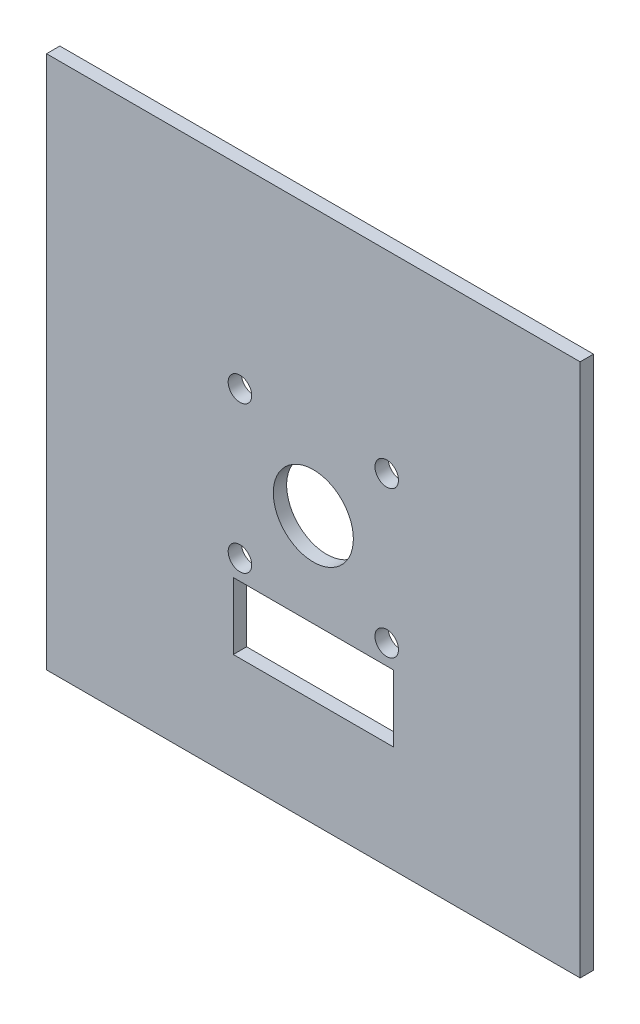
ISO-10303-21;
HEADER;
FILE_DESCRIPTION(('STEP AP214'),'2;1');
FILE_NAME('part.step','',(''),(''),'','','');
FILE_SCHEMA(('AUTOMOTIVE_DESIGN { 1 0 10303 214 1 1 1 1 }'));
ENDSEC;
DATA;
#1=APPLICATION_CONTEXT('core data for automotive mechanical design processes');
#2=APPLICATION_PROTOCOL_DEFINITION('international standard','automotive_design',2000,#1);
#3=PRODUCT_CONTEXT('',#1,'mechanical');
#4=PRODUCT('Part','Part','',(#3));
#5=PRODUCT_RELATED_PRODUCT_CATEGORY('part','',(#4));
#6=PRODUCT_DEFINITION_FORMATION('','',#4);
#7=PRODUCT_DEFINITION_CONTEXT('part definition',#1,'design');
#8=PRODUCT_DEFINITION('design','',#6,#7);
#9=PRODUCT_DEFINITION_SHAPE('','',#8);
#10=(LENGTH_UNIT() NAMED_UNIT(*) SI_UNIT(.MILLI.,.METRE.));
#11=(NAMED_UNIT(*) PLANE_ANGLE_UNIT() SI_UNIT($,.RADIAN.));
#12=(NAMED_UNIT(*) SI_UNIT($,.STERADIAN.) SOLID_ANGLE_UNIT());
#13=UNCERTAINTY_MEASURE_WITH_UNIT(LENGTH_MEASURE(1.E-05),#10,'distance_accuracy_value','');
#14=(GEOMETRIC_REPRESENTATION_CONTEXT(3) GLOBAL_UNCERTAINTY_ASSIGNED_CONTEXT((#13)) GLOBAL_UNIT_ASSIGNED_CONTEXT((#10,
#11,#12)) REPRESENTATION_CONTEXT('',''));
#15=CARTESIAN_POINT('',(0.,0.,0.));
#16=DIRECTION('',(0.,0.,1.));
#17=DIRECTION('',(1.,0.,0.));
#18=AXIS2_PLACEMENT_3D('',#15,#16,#17);
#19=CARTESIAN_POINT('',(0.,-127.,3.175));
#20=DIRECTION('',(0.,1.,0.));
#21=DIRECTION('',(0.,0.,1.));
#22=AXIS2_PLACEMENT_3D('',#19,#20,#21);
#23=PLANE('',#22);
#24=DIRECTION('',(1.,0.,0.));
#25=VECTOR('',#24,1.);
#26=CARTESIAN_POINT('',(0.,-127.,-3.175));
#27=LINE('',#26,#25);
#28=CARTESIAN_POINT('',(-127.,-127.,-3.175));
#29=VERTEX_POINT('',#28);
#30=CARTESIAN_POINT('',(127.,-127.,-3.175));
#31=VERTEX_POINT('',#30);
#32=EDGE_CURVE('E158',#29,#31,#27,.T.);
#33=ORIENTED_EDGE('',*,*,#32,.T.);
#34=DIRECTION('',(0.,0.,-1.));
#35=VECTOR('',#34,1.);
#36=CARTESIAN_POINT('',(127.,-127.,3.175));
#37=LINE('',#36,#35);
#38=CARTESIAN_POINT('',(127.,-127.,3.175));
#39=VERTEX_POINT('',#38);
#40=EDGE_CURVE('E11',#39,#31,#37,.T.);
#41=ORIENTED_EDGE('',*,*,#40,.F.);
#42=DIRECTION('',(1.,0.,0.));
#43=VECTOR('',#42,1.);
#44=CARTESIAN_POINT('',(0.,-127.,3.175));
#45=LINE('',#44,#43);
#46=CARTESIAN_POINT('',(-127.,-127.,3.175));
#47=VERTEX_POINT('',#46);
#48=EDGE_CURVE('E114',#47,#39,#45,.T.);
#49=ORIENTED_EDGE('',*,*,#48,.F.);
#50=DIRECTION('',(0.,0.,-1.));
#51=VECTOR('',#50,1.);
#52=CARTESIAN_POINT('',(-127.,-127.,3.175));
#53=LINE('',#52,#51);
#54=EDGE_CURVE('E53',#47,#29,#53,.T.);
#55=ORIENTED_EDGE('',*,*,#54,.T.);
#56=EDGE_LOOP('',(#33,#41,#49,#55));
#57=FACE_BOUND('',#56,.T.);
#58=ADVANCED_FACE('F34',(#57),#23,.F.);
#59=CARTESIAN_POINT('',(127.,0.,3.175));
#60=DIRECTION('',(-1.,0.,0.));
#61=DIRECTION('',(0.,0.,1.));
#62=AXIS2_PLACEMENT_3D('',#59,#60,#61);
#63=PLANE('',#62);
#64=DIRECTION('',(0.,1.,0.));
#65=VECTOR('',#64,1.);
#66=CARTESIAN_POINT('',(127.,0.,-3.175));
#67=LINE('',#66,#65);
#68=CARTESIAN_POINT('',(127.,127.,-3.175));
#69=VERTEX_POINT('',#68);
#70=EDGE_CURVE('E120',#31,#69,#67,.T.);
#71=ORIENTED_EDGE('',*,*,#70,.T.);
#72=DIRECTION('',(0.,0.,-1.));
#73=VECTOR('',#72,1.);
#74=CARTESIAN_POINT('',(127.,127.,3.175));
#75=LINE('',#74,#73);
#76=CARTESIAN_POINT('',(127.,127.,3.175));
#77=VERTEX_POINT('',#76);
#78=EDGE_CURVE('E44',#77,#69,#75,.T.);
#79=ORIENTED_EDGE('',*,*,#78,.F.);
#80=DIRECTION('',(0.,1.,0.));
#81=VECTOR('',#80,1.);
#82=CARTESIAN_POINT('',(127.,0.,3.175));
#83=LINE('',#82,#81);
#84=EDGE_CURVE('E107',#39,#77,#83,.T.);
#85=ORIENTED_EDGE('',*,*,#84,.F.);
#86=ORIENTED_EDGE('',*,*,#40,.T.);
#87=EDGE_LOOP('',(#71,#79,#85,#86));
#88=FACE_BOUND('',#87,.T.);
#89=ADVANCED_FACE('F119',(#88),#63,.F.);
#90=CARTESIAN_POINT('',(0.,127.,3.175));
#91=DIRECTION('',(0.,1.,0.));
#92=DIRECTION('',(0.,0.,1.));
#93=AXIS2_PLACEMENT_3D('',#90,#91,#92);
#94=PLANE('',#93);
#95=DIRECTION('',(1.,0.,0.));
#96=VECTOR('',#95,1.);
#97=CARTESIAN_POINT('',(0.,127.,-3.175));
#98=LINE('',#97,#96);
#99=CARTESIAN_POINT('',(-127.,127.,-3.175));
#100=VERTEX_POINT('',#99);
#101=EDGE_CURVE('E161',#100,#69,#98,.T.);
#102=ORIENTED_EDGE('',*,*,#101,.F.);
#103=DIRECTION('',(0.,0.,-1.));
#104=VECTOR('',#103,1.);
#105=CARTESIAN_POINT('',(-127.,127.,3.175));
#106=LINE('',#105,#104);
#107=CARTESIAN_POINT('',(-127.,127.,3.175));
#108=VERTEX_POINT('',#107);
#109=EDGE_CURVE('E79',#108,#100,#106,.T.);
#110=ORIENTED_EDGE('',*,*,#109,.F.);
#111=DIRECTION('',(1.,0.,0.));
#112=VECTOR('',#111,1.);
#113=CARTESIAN_POINT('',(0.,127.,3.175));
#114=LINE('',#113,#112);
#115=EDGE_CURVE('E113',#108,#77,#114,.T.);
#116=ORIENTED_EDGE('',*,*,#115,.T.);
#117=ORIENTED_EDGE('',*,*,#78,.T.);
#118=EDGE_LOOP('',(#102,#110,#116,#117));
#119=FACE_BOUND('',#118,.T.);
#120=ADVANCED_FACE('F124',(#119),#94,.T.);
#121=CARTESIAN_POINT('',(38.1,0.,3.175));
#122=DIRECTION('',(-1.,0.,0.));
#123=DIRECTION('',(0.,0.,1.));
#124=AXIS2_PLACEMENT_3D('',#121,#122,#123);
#125=PLANE('',#124);
#126=DIRECTION('',(0.,1.,0.));
#127=VECTOR('',#126,1.);
#128=CARTESIAN_POINT('',(38.1,0.,-3.175));
#129=LINE('',#128,#127);
#130=CARTESIAN_POINT('',(38.1,-76.2,-3.175));
#131=VERTEX_POINT('',#130);
#132=CARTESIAN_POINT('',(38.1,-44.45,-3.175));
#133=VERTEX_POINT('',#132);
#134=EDGE_CURVE('E146',#131,#133,#129,.T.);
#135=ORIENTED_EDGE('',*,*,#134,.F.);
#136=DIRECTION('',(0.,0.,-1.));
#137=VECTOR('',#136,1.);
#138=CARTESIAN_POINT('',(38.1,-76.2,3.175));
#139=LINE('',#138,#137);
#140=CARTESIAN_POINT('',(38.1,-76.2,3.175));
#141=VERTEX_POINT('',#140);
#142=EDGE_CURVE('E38',#141,#131,#139,.T.);
#143=ORIENTED_EDGE('',*,*,#142,.F.);
#144=DIRECTION('',(0.,1.,0.));
#145=VECTOR('',#144,1.);
#146=CARTESIAN_POINT('',(38.1,0.,3.175));
#147=LINE('',#146,#145);
#148=CARTESIAN_POINT('',(38.1,-44.45,3.175));
#149=VERTEX_POINT('',#148);
#150=EDGE_CURVE('E203',#141,#149,#147,.T.);
#151=ORIENTED_EDGE('',*,*,#150,.T.);
#152=DIRECTION('',(0.,0.,-1.));
#153=VECTOR('',#152,1.);
#154=CARTESIAN_POINT('',(38.1,-44.45,3.175));
#155=LINE('',#154,#153);
#156=EDGE_CURVE('E136',#149,#133,#155,.T.);
#157=ORIENTED_EDGE('',*,*,#156,.T.);
#158=EDGE_LOOP('',(#135,#143,#151,#157));
#159=FACE_BOUND('',#158,.T.);
#160=ADVANCED_FACE('F188',(#159),#125,.T.);
#161=CARTESIAN_POINT('',(0.,-76.2,3.175));
#162=DIRECTION('',(0.,1.,0.));
#163=DIRECTION('',(0.,0.,1.));
#164=AXIS2_PLACEMENT_3D('',#161,#162,#163);
#165=PLANE('',#164);
#166=DIRECTION('',(1.,0.,0.));
#167=VECTOR('',#166,1.);
#168=CARTESIAN_POINT('',(0.,-76.2,-3.175));
#169=LINE('',#168,#167);
#170=CARTESIAN_POINT('',(-38.1,-76.2,-3.175));
#171=VERTEX_POINT('',#170);
#172=EDGE_CURVE('E149',#171,#131,#169,.T.);
#173=ORIENTED_EDGE('',*,*,#172,.F.);
#174=DIRECTION('',(0.,0.,-1.));
#175=VECTOR('',#174,1.);
#176=CARTESIAN_POINT('',(-38.1,-76.2,3.175));
#177=LINE('',#176,#175);
#178=CARTESIAN_POINT('',(-38.1,-76.2,3.175));
#179=VERTEX_POINT('',#178);
#180=EDGE_CURVE('E178',#179,#171,#177,.T.);
#181=ORIENTED_EDGE('',*,*,#180,.F.);
#182=DIRECTION('',(1.,0.,0.));
#183=VECTOR('',#182,1.);
#184=CARTESIAN_POINT('',(0.,-76.2,3.175));
#185=LINE('',#184,#183);
#186=EDGE_CURVE('E187',#179,#141,#185,.T.);
#187=ORIENTED_EDGE('',*,*,#186,.T.);
#188=ORIENTED_EDGE('',*,*,#142,.T.);
#189=EDGE_LOOP('',(#173,#181,#187,#188));
#190=FACE_BOUND('',#189,.T.);
#191=ADVANCED_FACE('F185',(#190),#165,.T.);
#192=CARTESIAN_POINT('',(-38.1,0.,3.175));
#193=DIRECTION('',(-1.,0.,0.));
#194=DIRECTION('',(0.,0.,1.));
#195=AXIS2_PLACEMENT_3D('',#192,#193,#194);
#196=PLANE('',#195);
#197=DIRECTION('',(0.,1.,0.));
#198=VECTOR('',#197,1.);
#199=CARTESIAN_POINT('',(-38.1,0.,-3.175));
#200=LINE('',#199,#198);
#201=CARTESIAN_POINT('',(-38.1,-44.45,-3.175));
#202=VERTEX_POINT('',#201);
#203=EDGE_CURVE('E152',#171,#202,#200,.T.);
#204=ORIENTED_EDGE('',*,*,#203,.T.);
#205=DIRECTION('',(0.,0.,-1.));
#206=VECTOR('',#205,1.);
#207=CARTESIAN_POINT('',(-38.1,-44.45,3.175));
#208=LINE('',#207,#206);
#209=CARTESIAN_POINT('',(-38.1,-44.45,3.175));
#210=VERTEX_POINT('',#209);
#211=EDGE_CURVE('E176',#210,#202,#208,.T.);
#212=ORIENTED_EDGE('',*,*,#211,.F.);
#213=DIRECTION('',(0.,1.,0.));
#214=VECTOR('',#213,1.);
#215=CARTESIAN_POINT('',(-38.1,0.,3.175));
#216=LINE('',#215,#214);
#217=EDGE_CURVE('E196',#179,#210,#216,.T.);
#218=ORIENTED_EDGE('',*,*,#217,.F.);
#219=ORIENTED_EDGE('',*,*,#180,.T.);
#220=EDGE_LOOP('',(#204,#212,#218,#219));
#221=FACE_BOUND('',#220,.T.);
#222=ADVANCED_FACE('F194',(#221),#196,.F.);
#223=CARTESIAN_POINT('',(34.9249999999998,-34.9250000000002,3.175));
#224=DIRECTION('',(0.,0.,-1.));
#225=DIRECTION('',(-1.,0.,0.));
#226=AXIS2_PLACEMENT_3D('',#223,#224,#225);
#227=CYLINDRICAL_SURFACE('',#226,5.60309347545686);
#228=CARTESIAN_POINT('',(34.9249999999998,-34.9250000000002,3.175));
#229=DIRECTION('',(0.,0.,1.));
#230=DIRECTION('',(1.,0.,0.));
#231=AXIS2_PLACEMENT_3D('',#228,#229,#230);
#232=CIRCLE('',#231,5.60309347545686);
#233=CARTESIAN_POINT('',(40.5280934754566,-34.9250000000002,3.175));
#234=VERTEX_POINT('',#233);
#235=EDGE_CURVE('E127',#234,#234,#232,.T.);
#236=ORIENTED_EDGE('',*,*,#235,.T.);
#237=EDGE_LOOP('',(#236));
#238=FACE_BOUND('',#237,.T.);
#239=CARTESIAN_POINT('',(34.9249999999998,-34.9250000000002,-3.175));
#240=DIRECTION('',(0.,0.,1.));
#241=DIRECTION('',(1.,0.,0.));
#242=AXIS2_PLACEMENT_3D('',#239,#240,#241);
#243=CIRCLE('',#242,5.60309347545686);
#244=CARTESIAN_POINT('',(40.5280934754566,-34.9250000000002,-3.175));
#245=VERTEX_POINT('',#244);
#246=EDGE_CURVE('E166',#245,#245,#243,.T.);
#247=ORIENTED_EDGE('',*,*,#246,.F.);
#248=EDGE_LOOP('',(#247));
#249=FACE_BOUND('',#248,.T.);
#250=ADVANCED_FACE('F253',(#238,#249),#227,.F.);
#251=CARTESIAN_POINT('',(-127.,0.,3.175));
#252=DIRECTION('',(-1.,0.,0.));
#253=DIRECTION('',(0.,0.,1.));
#254=AXIS2_PLACEMENT_3D('',#251,#252,#253);
#255=PLANE('',#254);
#256=DIRECTION('',(0.,1.,0.));
#257=VECTOR('',#256,1.);
#258=CARTESIAN_POINT('',(-127.,0.,-3.175));
#259=LINE('',#258,#257);
#260=EDGE_CURVE('E163',#29,#100,#259,.T.);
#261=ORIENTED_EDGE('',*,*,#260,.F.);
#262=ORIENTED_EDGE('',*,*,#54,.F.);
#263=DIRECTION('',(0.,1.,0.));
#264=VECTOR('',#263,1.);
#265=CARTESIAN_POINT('',(-127.,0.,3.175));
#266=LINE('',#265,#264);
#267=EDGE_CURVE('E125',#47,#108,#266,.T.);
#268=ORIENTED_EDGE('',*,*,#267,.T.);
#269=ORIENTED_EDGE('',*,*,#109,.T.);
#270=EDGE_LOOP('',(#261,#262,#268,#269));
#271=FACE_BOUND('',#270,.T.);
#272=ADVANCED_FACE('F240',(#271),#255,.T.);
#273=CARTESIAN_POINT('',(0.,-44.45,3.175));
#274=DIRECTION('',(0.,1.,0.));
#275=DIRECTION('',(0.,0.,1.));
#276=AXIS2_PLACEMENT_3D('',#273,#274,#275);
#277=PLANE('',#276);
#278=DIRECTION('',(1.,0.,0.));
#279=VECTOR('',#278,1.);
#280=CARTESIAN_POINT('',(0.,-44.45,-3.175));
#281=LINE('',#280,#279);
#282=EDGE_CURVE('E155',#202,#133,#281,.T.);
#283=ORIENTED_EDGE('',*,*,#282,.T.);
#284=ORIENTED_EDGE('',*,*,#156,.F.);
#285=DIRECTION('',(1.,0.,0.));
#286=VECTOR('',#285,1.);
#287=CARTESIAN_POINT('',(0.,-44.45,3.175));
#288=LINE('',#287,#286);
#289=EDGE_CURVE('E199',#210,#149,#288,.T.);
#290=ORIENTED_EDGE('',*,*,#289,.F.);
#291=ORIENTED_EDGE('',*,*,#211,.T.);
#292=EDGE_LOOP('',(#283,#284,#290,#291));
#293=FACE_BOUND('',#292,.T.);
#294=ADVANCED_FACE('F198',(#293),#277,.F.);
#295=CARTESIAN_POINT('',(0.,0.,3.175));
#296=DIRECTION('',(0.,0.,-1.));
#297=DIRECTION('',(-1.,0.,0.));
#298=AXIS2_PLACEMENT_3D('',#295,#296,#297);
#299=CYLINDRICAL_SURFACE('',#298,19.05);
#300=CARTESIAN_POINT('',(0.,0.,3.175));
#301=DIRECTION('',(0.,0.,1.));
#302=DIRECTION('',(1.,0.,0.));
#303=AXIS2_PLACEMENT_3D('',#300,#301,#302);
#304=CIRCLE('',#303,19.05);
#305=CARTESIAN_POINT('',(19.05,0.,3.175));
#306=VERTEX_POINT('',#305);
#307=EDGE_CURVE('E207',#306,#306,#304,.T.);
#308=ORIENTED_EDGE('',*,*,#307,.T.);
#309=EDGE_LOOP('',(#308));
#310=FACE_BOUND('',#309,.T.);
#311=CARTESIAN_POINT('',(0.,0.,-3.175));
#312=DIRECTION('',(0.,0.,1.));
#313=DIRECTION('',(1.,0.,0.));
#314=AXIS2_PLACEMENT_3D('',#311,#312,#313);
#315=CIRCLE('',#314,19.05);
#316=CARTESIAN_POINT('',(19.05,0.,-3.175));
#317=VERTEX_POINT('',#316);
#318=EDGE_CURVE('E143',#317,#317,#315,.T.);
#319=ORIENTED_EDGE('',*,*,#318,.F.);
#320=EDGE_LOOP('',(#319));
#321=FACE_BOUND('',#320,.T.);
#322=ADVANCED_FACE('F231',(#310,#321),#299,.F.);
#323=CARTESIAN_POINT('',(-34.925,34.925,3.175));
#324=DIRECTION('',(0.,0.,-1.));
#325=DIRECTION('',(-1.,0.,0.));
#326=AXIS2_PLACEMENT_3D('',#323,#324,#325);
#327=CYLINDRICAL_SURFACE('',#326,5.60309347545684);
#328=CARTESIAN_POINT('',(-34.925,34.925,3.175));
#329=DIRECTION('',(0.,0.,1.));
#330=DIRECTION('',(1.,0.,0.));
#331=AXIS2_PLACEMENT_3D('',#328,#329,#330);
#332=CIRCLE('',#331,5.60309347545684);
#333=CARTESIAN_POINT('',(-29.3219065245432,34.925,3.175));
#334=VERTEX_POINT('',#333);
#335=EDGE_CURVE('E210',#334,#334,#332,.T.);
#336=ORIENTED_EDGE('',*,*,#335,.T.);
#337=EDGE_LOOP('',(#336));
#338=FACE_BOUND('',#337,.T.);
#339=CARTESIAN_POINT('',(-34.925,34.925,-3.175));
#340=DIRECTION('',(0.,0.,1.));
#341=DIRECTION('',(1.,0.,0.));
#342=AXIS2_PLACEMENT_3D('',#339,#340,#341);
#343=CIRCLE('',#342,5.60309347545684);
#344=CARTESIAN_POINT('',(-29.3219065245432,34.925,-3.175));
#345=VERTEX_POINT('',#344);
#346=EDGE_CURVE('E140',#345,#345,#343,.T.);
#347=ORIENTED_EDGE('',*,*,#346,.F.);
#348=EDGE_LOOP('',(#347));
#349=FACE_BOUND('',#348,.T.);
#350=ADVANCED_FACE('F221',(#338,#349),#327,.F.);
#351=CARTESIAN_POINT('',(34.9249999999998,34.9250000000002,3.175));
#352=DIRECTION('',(0.,0.,-1.));
#353=DIRECTION('',(-1.,0.,0.));
#354=AXIS2_PLACEMENT_3D('',#351,#352,#353);
#355=CYLINDRICAL_SURFACE('',#354,5.60309347545686);
#356=CARTESIAN_POINT('',(34.9249999999998,34.9250000000002,3.175));
#357=DIRECTION('',(0.,0.,1.));
#358=DIRECTION('',(1.,0.,0.));
#359=AXIS2_PLACEMENT_3D('',#356,#357,#358);
#360=CIRCLE('',#359,5.60309347545686);
#361=CARTESIAN_POINT('',(40.5280934754566,34.9250000000002,3.175));
#362=VERTEX_POINT('',#361);
#363=EDGE_CURVE('E172',#362,#362,#360,.F.);
#364=ORIENTED_EDGE('',*,*,#363,.F.);
#365=EDGE_LOOP('',(#364));
#366=FACE_BOUND('',#365,.T.);
#367=CARTESIAN_POINT('',(34.9249999999998,34.9250000000002,-3.175));
#368=DIRECTION('',(0.,0.,1.));
#369=DIRECTION('',(1.,0.,0.));
#370=AXIS2_PLACEMENT_3D('',#367,#368,#369);
#371=CIRCLE('',#370,5.60309347545686);
#372=CARTESIAN_POINT('',(40.5280934754566,34.9250000000002,-3.175));
#373=VERTEX_POINT('',#372);
#374=EDGE_CURVE('E137',#373,#373,#371,.F.);
#375=ORIENTED_EDGE('',*,*,#374,.T.);
#376=EDGE_LOOP('',(#375));
#377=FACE_BOUND('',#376,.T.);
#378=ADVANCED_FACE('F36',(#366,#377),#355,.F.);
#379=CARTESIAN_POINT('',(-34.925,-34.925,3.175));
#380=DIRECTION('',(0.,0.,-1.));
#381=DIRECTION('',(-1.,0.,0.));
#382=AXIS2_PLACEMENT_3D('',#379,#380,#381);
#383=CYLINDRICAL_SURFACE('',#382,5.60309347545684);
#384=CARTESIAN_POINT('',(-34.925,-34.925,3.175));
#385=DIRECTION('',(0.,0.,1.));
#386=DIRECTION('',(1.,0.,0.));
#387=AXIS2_PLACEMENT_3D('',#384,#385,#386);
#388=CIRCLE('',#387,5.60309347545684);
#389=CARTESIAN_POINT('',(-29.3219065245432,-34.925,3.175));
#390=VERTEX_POINT('',#389);
#391=EDGE_CURVE('E133',#390,#390,#388,.F.);
#392=ORIENTED_EDGE('',*,*,#391,.F.);
#393=EDGE_LOOP('',(#392));
#394=FACE_BOUND('',#393,.T.);
#395=CARTESIAN_POINT('',(-34.925,-34.925,-3.175));
#396=DIRECTION('',(0.,0.,1.));
#397=DIRECTION('',(1.,0.,0.));
#398=AXIS2_PLACEMENT_3D('',#395,#396,#397);
#399=CIRCLE('',#398,5.60309347545684);
#400=CARTESIAN_POINT('',(-29.3219065245432,-34.925,-3.175));
#401=VERTEX_POINT('',#400);
#402=EDGE_CURVE('E169',#401,#401,#399,.F.);
#403=ORIENTED_EDGE('',*,*,#402,.T.);
#404=EDGE_LOOP('',(#403));
#405=FACE_BOUND('',#404,.T.);
#406=ADVANCED_FACE('F220',(#394,#405),#383,.F.);
#407=CARTESIAN_POINT('',(0.,0.,3.175));
#408=DIRECTION('',(0.,0.,1.));
#409=DIRECTION('',(1.,0.,0.));
#410=AXIS2_PLACEMENT_3D('',#407,#408,#409);
#411=PLANE('',#410);
#412=ORIENTED_EDGE('',*,*,#363,.T.);
#413=EDGE_LOOP('',(#412));
#414=FACE_BOUND('',#413,.T.);
#415=ORIENTED_EDGE('',*,*,#335,.F.);
#416=EDGE_LOOP('',(#415));
#417=FACE_BOUND('',#416,.T.);
#418=ORIENTED_EDGE('',*,*,#307,.F.);
#419=EDGE_LOOP('',(#418));
#420=FACE_BOUND('',#419,.T.);
#421=ORIENTED_EDGE('',*,*,#150,.F.);
#422=ORIENTED_EDGE('',*,*,#186,.F.);
#423=ORIENTED_EDGE('',*,*,#217,.T.);
#424=ORIENTED_EDGE('',*,*,#289,.T.);
#425=EDGE_LOOP('',(#421,#422,#423,#424));
#426=FACE_BOUND('',#425,.T.);
#427=ORIENTED_EDGE('',*,*,#48,.T.);
#428=ORIENTED_EDGE('',*,*,#84,.T.);
#429=ORIENTED_EDGE('',*,*,#115,.F.);
#430=ORIENTED_EDGE('',*,*,#267,.F.);
#431=EDGE_LOOP('',(#427,#428,#429,#430));
#432=FACE_BOUND('',#431,.T.);
#433=ORIENTED_EDGE('',*,*,#235,.F.);
#434=EDGE_LOOP('',(#433));
#435=FACE_BOUND('',#434,.T.);
#436=ORIENTED_EDGE('',*,*,#391,.T.);
#437=EDGE_LOOP('',(#436));
#438=FACE_BOUND('',#437,.T.);
#439=ADVANCED_FACE('F109',(#414,#417,#420,#426,#432,#435,#438),#411,.T.);
#440=CARTESIAN_POINT('',(0.,0.,-3.175));
#441=DIRECTION('',(0.,0.,1.));
#442=DIRECTION('',(1.,0.,0.));
#443=AXIS2_PLACEMENT_3D('',#440,#441,#442);
#444=PLANE('',#443);
#445=ORIENTED_EDGE('',*,*,#374,.F.);
#446=EDGE_LOOP('',(#445));
#447=FACE_BOUND('',#446,.T.);
#448=ORIENTED_EDGE('',*,*,#346,.T.);
#449=EDGE_LOOP('',(#448));
#450=FACE_BOUND('',#449,.T.);
#451=ORIENTED_EDGE('',*,*,#318,.T.);
#452=EDGE_LOOP('',(#451));
#453=FACE_BOUND('',#452,.T.);
#454=ORIENTED_EDGE('',*,*,#134,.T.);
#455=ORIENTED_EDGE('',*,*,#282,.F.);
#456=ORIENTED_EDGE('',*,*,#203,.F.);
#457=ORIENTED_EDGE('',*,*,#172,.T.);
#458=EDGE_LOOP('',(#454,#455,#456,#457));
#459=FACE_BOUND('',#458,.T.);
#460=ORIENTED_EDGE('',*,*,#32,.F.);
#461=ORIENTED_EDGE('',*,*,#260,.T.);
#462=ORIENTED_EDGE('',*,*,#101,.T.);
#463=ORIENTED_EDGE('',*,*,#70,.F.);
#464=EDGE_LOOP('',(#460,#461,#462,#463));
#465=FACE_BOUND('',#464,.T.);
#466=ORIENTED_EDGE('',*,*,#246,.T.);
#467=EDGE_LOOP('',(#466));
#468=FACE_BOUND('',#467,.T.);
#469=ORIENTED_EDGE('',*,*,#402,.F.);
#470=EDGE_LOOP('',(#469));
#471=FACE_BOUND('',#470,.T.);
#472=ADVANCED_FACE('F191',(#447,#450,#453,#459,#465,#468,#471),#444,.F.);
#473=CLOSED_SHELL('',(#58,#89,#120,#160,#191,#222,#250,#272,#294,#322,#350,#378,#406,#439,#472));
#474=MANIFOLD_SOLID_BREP('B2',#473);
#475=ADVANCED_BREP_SHAPE_REPRESENTATION('',(#18,#474),#14);
#476=SHAPE_DEFINITION_REPRESENTATION(#9,#475);
ENDSEC;
END-ISO-10303-21;
